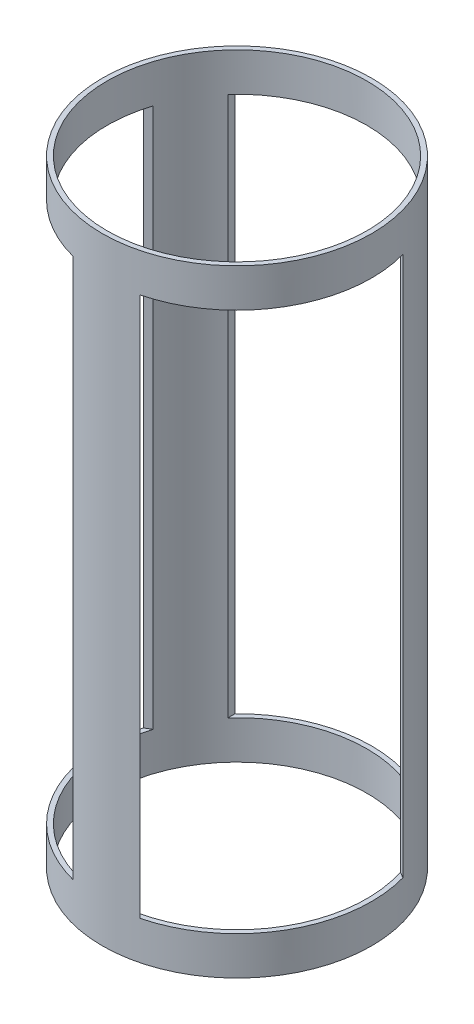
ISO-10303-21;
HEADER;
FILE_DESCRIPTION(('STEP AP214'),'2;1');
FILE_NAME('part.step','',(''),(''),'','','');
FILE_SCHEMA(('AUTOMOTIVE_DESIGN { 1 0 10303 214 1 1 1 1 }'));
ENDSEC;
DATA;
#1=APPLICATION_CONTEXT('core data for automotive mechanical design processes');
#2=APPLICATION_PROTOCOL_DEFINITION('international standard','automotive_design',2000,#1);
#3=PRODUCT_CONTEXT('',#1,'mechanical');
#4=PRODUCT('Part','Part','',(#3));
#5=PRODUCT_RELATED_PRODUCT_CATEGORY('part','',(#4));
#6=PRODUCT_DEFINITION_FORMATION('','',#4);
#7=PRODUCT_DEFINITION_CONTEXT('part definition',#1,'design');
#8=PRODUCT_DEFINITION('design','',#6,#7);
#9=PRODUCT_DEFINITION_SHAPE('','',#8);
#10=(LENGTH_UNIT() NAMED_UNIT(*) SI_UNIT(.MILLI.,.METRE.));
#11=(NAMED_UNIT(*) PLANE_ANGLE_UNIT() SI_UNIT($,.RADIAN.));
#12=(NAMED_UNIT(*) SI_UNIT($,.STERADIAN.) SOLID_ANGLE_UNIT());
#13=UNCERTAINTY_MEASURE_WITH_UNIT(LENGTH_MEASURE(1.E-05),#10,'distance_accuracy_value','');
#14=(GEOMETRIC_REPRESENTATION_CONTEXT(3) GLOBAL_UNCERTAINTY_ASSIGNED_CONTEXT((#13)) GLOBAL_UNIT_ASSIGNED_CONTEXT((#10,
#11,#12)) REPRESENTATION_CONTEXT('',''));
#15=CARTESIAN_POINT('',(0.,0.,0.));
#16=DIRECTION('',(0.,0.,1.));
#17=DIRECTION('',(1.,0.,0.));
#18=AXIS2_PLACEMENT_3D('',#15,#16,#17);
#19=CARTESIAN_POINT('',(0.,203.581,0.));
#20=DIRECTION('',(0.,1.,0.));
#21=DIRECTION('',(0.,0.,1.));
#22=AXIS2_PLACEMENT_3D('',#19,#20,#21);
#23=PLANE('',#22);
#24=CARTESIAN_POINT('',(0.,203.581,0.));
#25=DIRECTION('',(0.,1.,0.));
#26=DIRECTION('',(0.,0.,1.));
#27=AXIS2_PLACEMENT_3D('',#24,#25,#26);
#28=CIRCLE('',#27,88.9);
#29=CARTESIAN_POINT('',(0.,203.581,88.9));
#30=VERTEX_POINT('',#29);
#31=EDGE_CURVE('E230',#30,#30,#28,.T.);
#32=ORIENTED_EDGE('',*,*,#31,.T.);
#33=EDGE_LOOP('',(#32));
#34=FACE_BOUND('',#33,.T.);
#35=CARTESIAN_POINT('',(0.,203.581,0.));
#36=DIRECTION('',(0.,1.,0.));
#37=DIRECTION('',(0.,0.,1.));
#38=AXIS2_PLACEMENT_3D('',#35,#36,#37);
#39=CIRCLE('',#38,85.725);
#40=CARTESIAN_POINT('',(0.,203.581,85.725));
#41=VERTEX_POINT('',#40);
#42=EDGE_CURVE('E224',#41,#41,#39,.T.);
#43=ORIENTED_EDGE('',*,*,#42,.F.);
#44=EDGE_LOOP('',(#43));
#45=FACE_BOUND('',#44,.T.);
#46=ADVANCED_FACE('F45',(#34,#45),#23,.T.);
#47=CARTESIAN_POINT('',(0.,-203.581,0.));
#48=DIRECTION('',(0.,1.,0.));
#49=DIRECTION('',(0.,0.,1.));
#50=AXIS2_PLACEMENT_3D('',#47,#48,#49);
#51=PLANE('',#50);
#52=CARTESIAN_POINT('',(0.,-203.581,0.));
#53=DIRECTION('',(0.,1.,0.));
#54=DIRECTION('',(0.,0.,1.));
#55=AXIS2_PLACEMENT_3D('',#52,#53,#54);
#56=CIRCLE('',#55,88.9);
#57=CARTESIAN_POINT('',(0.,-203.581,88.9));
#58=VERTEX_POINT('',#57);
#59=EDGE_CURVE('E227',#58,#58,#56,.T.);
#60=ORIENTED_EDGE('',*,*,#59,.F.);
#61=EDGE_LOOP('',(#60));
#62=FACE_BOUND('',#61,.T.);
#63=CARTESIAN_POINT('',(0.,-203.581,0.));
#64=DIRECTION('',(0.,1.,0.));
#65=DIRECTION('',(0.,0.,1.));
#66=AXIS2_PLACEMENT_3D('',#63,#64,#65);
#67=CIRCLE('',#66,85.725);
#68=CARTESIAN_POINT('',(0.,-203.581,85.725));
#69=VERTEX_POINT('',#68);
#70=EDGE_CURVE('E204',#69,#69,#67,.T.);
#71=ORIENTED_EDGE('',*,*,#70,.T.);
#72=EDGE_LOOP('',(#71));
#73=FACE_BOUND('',#72,.T.);
#74=ADVANCED_FACE('F260',(#62,#73),#51,.F.);
#75=CARTESIAN_POINT('',(0.,203.581,0.));
#76=DIRECTION('',(0.,-1.,0.));
#77=DIRECTION('',(0.,0.,-1.));
#78=AXIS2_PLACEMENT_3D('',#75,#76,#77);
#79=CYLINDRICAL_SURFACE('',#78,88.9);
#80=CARTESIAN_POINT('',(0.,-178.181,0.));
#81=DIRECTION('',(0.,-1.,0.));
#82=DIRECTION('',(0.866025403784436,0.,0.500000000000004));
#83=AXIS2_PLACEMENT_3D('',#80,#81,#82);
#84=CIRCLE('',#83,88.9);
#85=CARTESIAN_POINT('',(22.1315367264145,-178.181,86.1011328736583));
#86=VERTEX_POINT('',#85);
#87=CARTESIAN_POINT('',(85.631536726415,-178.181,-23.8840934069651));
#88=VERTEX_POINT('',#87);
#89=EDGE_CURVE('E166',#86,#88,#84,.F.);
#90=ORIENTED_EDGE('',*,*,#89,.F.);
#91=DIRECTION('',(0.,-1.,0.));
#92=VECTOR('',#91,1.);
#93=CARTESIAN_POINT('',(22.1315367264145,203.581,86.1011328736583));
#94=LINE('',#93,#92);
#95=CARTESIAN_POINT('',(22.1315367264145,178.181,86.1011328736583));
#96=VERTEX_POINT('',#95);
#97=EDGE_CURVE('E171',#96,#86,#94,.T.);
#98=ORIENTED_EDGE('',*,*,#97,.F.);
#99=CARTESIAN_POINT('',(0.,178.181,0.));
#100=DIRECTION('',(0.,1.,0.));
#101=DIRECTION('',(-0.866025403784436,0.,-0.500000000000004));
#102=AXIS2_PLACEMENT_3D('',#99,#100,#101);
#103=CIRCLE('',#102,88.9);
#104=CARTESIAN_POINT('',(85.631536726415,178.181,-23.8840934069651));
#105=VERTEX_POINT('',#104);
#106=EDGE_CURVE('E145',#105,#96,#103,.F.);
#107=ORIENTED_EDGE('',*,*,#106,.F.);
#108=DIRECTION('',(0.,-1.,0.));
#109=VECTOR('',#108,1.);
#110=CARTESIAN_POINT('',(85.631536726415,203.581,-23.8840934069651));
#111=LINE('',#110,#109);
#112=EDGE_CURVE('E60',#88,#105,#111,.F.);
#113=ORIENTED_EDGE('',*,*,#112,.F.);
#114=EDGE_LOOP('',(#90,#98,#107,#113));
#115=FACE_BOUND('',#114,.T.);
#116=CARTESIAN_POINT('',(0.,-178.181,0.));
#117=DIRECTION('',(0.,-1.,0.));
#118=DIRECTION('',(-0.866025403784443,0.,0.499999999999992));
#119=AXIS2_PLACEMENT_3D('',#116,#117,#118);
#120=CIRCLE('',#119,88.9);
#121=CARTESIAN_POINT('',(-85.6315367264147,-178.181,-23.8840934069663));
#122=VERTEX_POINT('',#121);
#123=CARTESIAN_POINT('',(-22.1315367264157,-178.181,86.101132873658));
#124=VERTEX_POINT('',#123);
#125=EDGE_CURVE('E195',#122,#124,#120,.F.);
#126=ORIENTED_EDGE('',*,*,#125,.F.);
#127=DIRECTION('',(0.,-1.,0.));
#128=VECTOR('',#127,1.);
#129=CARTESIAN_POINT('',(-85.6315367264147,203.581,-23.8840934069663));
#130=LINE('',#129,#128);
#131=CARTESIAN_POINT('',(-85.6315367264147,178.181,-23.8840934069663));
#132=VERTEX_POINT('',#131);
#133=EDGE_CURVE('E146',#132,#122,#130,.T.);
#134=ORIENTED_EDGE('',*,*,#133,.F.);
#135=CARTESIAN_POINT('',(0.,178.181,0.));
#136=DIRECTION('',(0.,1.,0.));
#137=DIRECTION('',(0.866025403784443,0.,-0.499999999999992));
#138=AXIS2_PLACEMENT_3D('',#135,#136,#137);
#139=CIRCLE('',#138,88.9);
#140=CARTESIAN_POINT('',(-22.1315367264157,178.181,86.101132873658));
#141=VERTEX_POINT('',#140);
#142=EDGE_CURVE('E177',#141,#132,#139,.F.);
#143=ORIENTED_EDGE('',*,*,#142,.F.);
#144=DIRECTION('',(0.,-1.,0.));
#145=VECTOR('',#144,1.);
#146=CARTESIAN_POINT('',(-22.1315367264157,203.581,86.101132873658));
#147=LINE('',#146,#145);
#148=EDGE_CURVE('E68',#124,#141,#147,.F.);
#149=ORIENTED_EDGE('',*,*,#148,.F.);
#150=EDGE_LOOP('',(#126,#134,#143,#149));
#151=FACE_BOUND('',#150,.T.);
#152=CARTESIAN_POINT('',(0.,-178.181,0.));
#153=DIRECTION('',(0.,-1.,0.));
#154=DIRECTION('',(0.,0.,-1.));
#155=AXIS2_PLACEMENT_3D('',#152,#153,#154);
#156=CIRCLE('',#155,88.9);
#157=CARTESIAN_POINT('',(63.5,-178.181,-62.2170394666927));
#158=VERTEX_POINT('',#157);
#159=CARTESIAN_POINT('',(-63.5,-178.181,-62.2170394666927));
#160=VERTEX_POINT('',#159);
#161=EDGE_CURVE('E205',#158,#160,#156,.F.);
#162=ORIENTED_EDGE('',*,*,#161,.F.);
#163=DIRECTION('',(0.,-1.,0.));
#164=VECTOR('',#163,1.);
#165=CARTESIAN_POINT('',(63.5,203.581,-62.2170394666927));
#166=LINE('',#165,#164);
#167=CARTESIAN_POINT('',(63.5,178.181,-62.2170394666927));
#168=VERTEX_POINT('',#167);
#169=EDGE_CURVE('E208',#168,#158,#166,.T.);
#170=ORIENTED_EDGE('',*,*,#169,.F.);
#171=CARTESIAN_POINT('',(0.,178.181,0.));
#172=DIRECTION('',(0.,1.,0.));
#173=DIRECTION('',(0.,0.,1.));
#174=AXIS2_PLACEMENT_3D('',#171,#172,#173);
#175=CIRCLE('',#174,88.9);
#176=CARTESIAN_POINT('',(-63.5,178.181,-62.2170394666927));
#177=VERTEX_POINT('',#176);
#178=EDGE_CURVE('E211',#177,#168,#175,.F.);
#179=ORIENTED_EDGE('',*,*,#178,.F.);
#180=DIRECTION('',(0.,-1.,0.));
#181=VECTOR('',#180,1.);
#182=CARTESIAN_POINT('',(-63.5,203.581,-62.2170394666927));
#183=LINE('',#182,#181);
#184=EDGE_CURVE('E202',#160,#177,#183,.F.);
#185=ORIENTED_EDGE('',*,*,#184,.F.);
#186=EDGE_LOOP('',(#162,#170,#179,#185));
#187=FACE_BOUND('',#186,.T.);
#188=ORIENTED_EDGE('',*,*,#31,.F.);
#189=EDGE_LOOP('',(#188));
#190=FACE_BOUND('',#189,.T.);
#191=ORIENTED_EDGE('',*,*,#59,.T.);
#192=EDGE_LOOP('',(#191));
#193=FACE_BOUND('',#192,.T.);
#194=ADVANCED_FACE('F47',(#115,#151,#187,#190,#193),#79,.T.);
#195=CARTESIAN_POINT('',(0.,203.581,0.));
#196=DIRECTION('',(0.,-1.,0.));
#197=DIRECTION('',(0.,0.,-1.));
#198=AXIS2_PLACEMENT_3D('',#195,#196,#197);
#199=CYLINDRICAL_SURFACE('',#198,85.725);
#200=DIRECTION('',(0.,-1.,0.));
#201=VECTOR('',#200,1.);
#202=CARTESIAN_POINT('',(18.1237828798855,203.581,83.787255111519));
#203=LINE('',#202,#201);
#204=CARTESIAN_POINT('',(18.1237828798855,-178.181,83.787255111519));
#205=VERTEX_POINT('',#204);
#206=CARTESIAN_POINT('',(18.1237828798855,178.181,83.787255111519));
#207=VERTEX_POINT('',#206);
#208=EDGE_CURVE('E169',#205,#207,#203,.F.);
#209=ORIENTED_EDGE('',*,*,#208,.F.);
#210=CARTESIAN_POINT('',(0.,-178.181,0.));
#211=DIRECTION('',(0.,-1.,0.));
#212=DIRECTION('',(0.866025403784436,0.,0.500000000000004));
#213=AXIS2_PLACEMENT_3D('',#210,#211,#212);
#214=CIRCLE('',#213,85.725);
#215=CARTESIAN_POINT('',(81.623782879886,-178.181,-26.1979711691044));
#216=VERTEX_POINT('',#215);
#217=EDGE_CURVE('E155',#216,#205,#214,.T.);
#218=ORIENTED_EDGE('',*,*,#217,.F.);
#219=DIRECTION('',(0.,-1.,0.));
#220=VECTOR('',#219,1.);
#221=CARTESIAN_POINT('',(81.623782879886,203.581,-26.1979711691044));
#222=LINE('',#221,#220);
#223=CARTESIAN_POINT('',(81.623782879886,178.181,-26.1979711691044));
#224=VERTEX_POINT('',#223);
#225=EDGE_CURVE('E149',#224,#216,#222,.T.);
#226=ORIENTED_EDGE('',*,*,#225,.F.);
#227=CARTESIAN_POINT('',(0.,178.181,0.));
#228=DIRECTION('',(0.,1.,0.));
#229=DIRECTION('',(-0.866025403784436,0.,-0.500000000000004));
#230=AXIS2_PLACEMENT_3D('',#227,#228,#229);
#231=CIRCLE('',#230,85.725);
#232=EDGE_CURVE('E136',#207,#224,#231,.T.);
#233=ORIENTED_EDGE('',*,*,#232,.F.);
#234=EDGE_LOOP('',(#209,#218,#226,#233));
#235=FACE_BOUND('',#234,.T.);
#236=DIRECTION('',(0.,-1.,0.));
#237=VECTOR('',#236,1.);
#238=CARTESIAN_POINT('',(-81.6237828798856,203.581,-26.1979711691055));
#239=LINE('',#238,#237);
#240=CARTESIAN_POINT('',(-81.6237828798856,-178.181,-26.1979711691055));
#241=VERTEX_POINT('',#240);
#242=CARTESIAN_POINT('',(-81.6237828798857,178.181,-26.1979711691055));
#243=VERTEX_POINT('',#242);
#244=EDGE_CURVE('E198',#241,#243,#239,.F.);
#245=ORIENTED_EDGE('',*,*,#244,.F.);
#246=CARTESIAN_POINT('',(0.,-178.181,0.));
#247=DIRECTION('',(0.,-1.,0.));
#248=DIRECTION('',(-0.866025403784443,0.,0.499999999999992));
#249=AXIS2_PLACEMENT_3D('',#246,#247,#248);
#250=CIRCLE('',#249,85.725);
#251=CARTESIAN_POINT('',(-18.1237828798867,-178.181,83.7872551115187));
#252=VERTEX_POINT('',#251);
#253=EDGE_CURVE('E190',#252,#241,#250,.T.);
#254=ORIENTED_EDGE('',*,*,#253,.F.);
#255=DIRECTION('',(0.,-1.,0.));
#256=VECTOR('',#255,1.);
#257=CARTESIAN_POINT('',(-18.1237828798867,203.581,83.7872551115187));
#258=LINE('',#257,#256);
#259=CARTESIAN_POINT('',(-18.1237828798867,178.181,83.7872551115187));
#260=VERTEX_POINT('',#259);
#261=EDGE_CURVE('E184',#260,#252,#258,.T.);
#262=ORIENTED_EDGE('',*,*,#261,.F.);
#263=CARTESIAN_POINT('',(0.,178.181,0.));
#264=DIRECTION('',(0.,1.,0.));
#265=DIRECTION('',(0.866025403784443,0.,-0.499999999999992));
#266=AXIS2_PLACEMENT_3D('',#263,#264,#265);
#267=CIRCLE('',#266,85.725);
#268=EDGE_CURVE('E175',#243,#260,#267,.T.);
#269=ORIENTED_EDGE('',*,*,#268,.F.);
#270=EDGE_LOOP('',(#245,#254,#262,#269));
#271=FACE_BOUND('',#270,.T.);
#272=DIRECTION('',(0.,-1.,0.));
#273=VECTOR('',#272,1.);
#274=CARTESIAN_POINT('',(63.5,203.581,-57.5892839424141));
#275=LINE('',#274,#273);
#276=CARTESIAN_POINT('',(63.5,-178.181,-57.5892839424141));
#277=VERTEX_POINT('',#276);
#278=CARTESIAN_POINT('',(63.5,178.181,-57.5892839424141));
#279=VERTEX_POINT('',#278);
#280=EDGE_CURVE('E11',#277,#279,#275,.F.);
#281=ORIENTED_EDGE('',*,*,#280,.F.);
#282=CARTESIAN_POINT('',(0.,-178.181,0.));
#283=DIRECTION('',(0.,-1.,0.));
#284=DIRECTION('',(0.,0.,-1.));
#285=AXIS2_PLACEMENT_3D('',#282,#283,#284);
#286=CIRCLE('',#285,85.725);
#287=CARTESIAN_POINT('',(-63.5,-178.181,-57.5892839424141));
#288=VERTEX_POINT('',#287);
#289=EDGE_CURVE('E53',#288,#277,#286,.T.);
#290=ORIENTED_EDGE('',*,*,#289,.F.);
#291=DIRECTION('',(0.,-1.,0.));
#292=VECTOR('',#291,1.);
#293=CARTESIAN_POINT('',(-63.5,203.581,-57.5892839424141));
#294=LINE('',#293,#292);
#295=CARTESIAN_POINT('',(-63.5,178.181,-57.5892839424141));
#296=VERTEX_POINT('',#295);
#297=EDGE_CURVE('E237',#296,#288,#294,.T.);
#298=ORIENTED_EDGE('',*,*,#297,.F.);
#299=CARTESIAN_POINT('',(0.,178.181,0.));
#300=DIRECTION('',(0.,1.,0.));
#301=DIRECTION('',(0.,0.,1.));
#302=AXIS2_PLACEMENT_3D('',#299,#300,#301);
#303=CIRCLE('',#302,85.725);
#304=EDGE_CURVE('E233',#279,#296,#303,.T.);
#305=ORIENTED_EDGE('',*,*,#304,.F.);
#306=EDGE_LOOP('',(#281,#290,#298,#305));
#307=FACE_BOUND('',#306,.T.);
#308=ORIENTED_EDGE('',*,*,#42,.T.);
#309=EDGE_LOOP('',(#308));
#310=FACE_BOUND('',#309,.T.);
#311=ORIENTED_EDGE('',*,*,#70,.F.);
#312=EDGE_LOOP('',(#311));
#313=FACE_BOUND('',#312,.T.);
#314=ADVANCED_FACE('F153',(#235,#271,#307,#310,#313),#199,.F.);
#315=CARTESIAN_POINT('',(63.5,-178.181,-88.901));
#316=DIRECTION('',(1.,0.,0.));
#317=DIRECTION('',(0.,0.,-1.));
#318=AXIS2_PLACEMENT_3D('',#315,#316,#317);
#319=PLANE('',#318);
#320=ORIENTED_EDGE('',*,*,#280,.T.);
#321=DIRECTION('',(0.,0.,1.));
#322=VECTOR('',#321,1.);
#323=CARTESIAN_POINT('',(63.5,178.181,-88.901));
#324=LINE('',#323,#322);
#325=EDGE_CURVE('E174',#168,#279,#324,.T.);
#326=ORIENTED_EDGE('',*,*,#325,.F.);
#327=ORIENTED_EDGE('',*,*,#169,.T.);
#328=DIRECTION('',(0.,0.,1.));
#329=VECTOR('',#328,1.);
#330=CARTESIAN_POINT('',(63.5,-178.181,-88.901));
#331=LINE('',#330,#329);
#332=EDGE_CURVE('E215',#158,#277,#331,.T.);
#333=ORIENTED_EDGE('',*,*,#332,.T.);
#334=EDGE_LOOP('',(#320,#326,#327,#333));
#335=FACE_BOUND('',#334,.T.);
#336=ADVANCED_FACE('F245',(#335),#319,.F.);
#337=CARTESIAN_POINT('',(-63.5,-178.181,-88.901));
#338=DIRECTION('',(0.,-1.,0.));
#339=DIRECTION('',(0.,0.,-1.));
#340=AXIS2_PLACEMENT_3D('',#337,#338,#339);
#341=PLANE('',#340);
#342=ORIENTED_EDGE('',*,*,#289,.T.);
#343=ORIENTED_EDGE('',*,*,#332,.F.);
#344=ORIENTED_EDGE('',*,*,#161,.T.);
#345=DIRECTION('',(0.,0.,1.));
#346=VECTOR('',#345,1.);
#347=CARTESIAN_POINT('',(-63.5,-178.181,-88.901));
#348=LINE('',#347,#346);
#349=EDGE_CURVE('E218',#160,#288,#348,.T.);
#350=ORIENTED_EDGE('',*,*,#349,.T.);
#351=EDGE_LOOP('',(#342,#343,#344,#350));
#352=FACE_BOUND('',#351,.T.);
#353=ADVANCED_FACE('F240',(#352),#341,.F.);
#354=CARTESIAN_POINT('',(-63.5,-178.181,-88.901));
#355=DIRECTION('',(-1.,0.,0.));
#356=DIRECTION('',(0.,0.,1.));
#357=AXIS2_PLACEMENT_3D('',#354,#355,#356);
#358=PLANE('',#357);
#359=ORIENTED_EDGE('',*,*,#297,.T.);
#360=ORIENTED_EDGE('',*,*,#349,.F.);
#361=ORIENTED_EDGE('',*,*,#184,.T.);
#362=DIRECTION('',(0.,0.,1.));
#363=VECTOR('',#362,1.);
#364=CARTESIAN_POINT('',(-63.5,178.181,-88.901));
#365=LINE('',#364,#363);
#366=EDGE_CURVE('E214',#177,#296,#365,.T.);
#367=ORIENTED_EDGE('',*,*,#366,.T.);
#368=EDGE_LOOP('',(#359,#360,#361,#367));
#369=FACE_BOUND('',#368,.T.);
#370=ADVANCED_FACE('F255',(#369),#358,.F.);
#371=CARTESIAN_POINT('',(-63.5,178.181,-88.901));
#372=DIRECTION('',(0.,1.,0.));
#373=DIRECTION('',(0.,0.,1.));
#374=AXIS2_PLACEMENT_3D('',#371,#372,#373);
#375=PLANE('',#374);
#376=ORIENTED_EDGE('',*,*,#304,.T.);
#377=ORIENTED_EDGE('',*,*,#366,.F.);
#378=ORIENTED_EDGE('',*,*,#178,.T.);
#379=ORIENTED_EDGE('',*,*,#325,.T.);
#380=EDGE_LOOP('',(#376,#377,#378,#379));
#381=FACE_BOUND('',#380,.T.);
#382=ADVANCED_FACE('F252',(#381),#375,.F.);
#383=CARTESIAN_POINT('',(-108.74052442184,-178.181,-10.5421131403129));
#384=DIRECTION('',(-0.499999999999992,0.,-0.866025403784443));
#385=DIRECTION('',(-0.866025403784443,0.,0.499999999999992));
#386=AXIS2_PLACEMENT_3D('',#383,#384,#385);
#387=PLANE('',#386);
#388=ORIENTED_EDGE('',*,*,#244,.T.);
#389=DIRECTION('',(0.866025403784443,0.,-0.499999999999992));
#390=VECTOR('',#389,1.);
#391=CARTESIAN_POINT('',(-108.74052442184,178.181,-10.5421131403129));
#392=LINE('',#391,#390);
#393=EDGE_CURVE('E181',#132,#243,#392,.T.);
#394=ORIENTED_EDGE('',*,*,#393,.F.);
#395=ORIENTED_EDGE('',*,*,#133,.T.);
#396=DIRECTION('',(0.866025403784443,0.,-0.499999999999992));
#397=VECTOR('',#396,1.);
#398=CARTESIAN_POINT('',(-108.74052442184,-178.181,-10.5421131403129));
#399=LINE('',#398,#397);
#400=EDGE_CURVE('E192',#122,#241,#399,.T.);
#401=ORIENTED_EDGE('',*,*,#400,.T.);
#402=EDGE_LOOP('',(#388,#394,#395,#401));
#403=FACE_BOUND('',#402,.T.);
#404=ADVANCED_FACE('F302',(#403),#387,.F.);
#405=CARTESIAN_POINT('',(-45.2405244218413,-178.181,99.4431131403114));
#406=DIRECTION('',(0.,-1.,0.));
#407=DIRECTION('',(-0.866025403784443,0.,0.499999999999992));
#408=AXIS2_PLACEMENT_3D('',#405,#406,#407);
#409=PLANE('',#408);
#410=ORIENTED_EDGE('',*,*,#253,.T.);
#411=ORIENTED_EDGE('',*,*,#400,.F.);
#412=ORIENTED_EDGE('',*,*,#125,.T.);
#413=DIRECTION('',(0.866025403784443,0.,-0.499999999999992));
#414=VECTOR('',#413,1.);
#415=CARTESIAN_POINT('',(-45.2405244218413,-178.181,99.4431131403114));
#416=LINE('',#415,#414);
#417=EDGE_CURVE('E186',#124,#252,#416,.T.);
#418=ORIENTED_EDGE('',*,*,#417,.T.);
#419=EDGE_LOOP('',(#410,#411,#412,#418));
#420=FACE_BOUND('',#419,.T.);
#421=ADVANCED_FACE('F308',(#420),#409,.F.);
#422=CARTESIAN_POINT('',(-45.2405244218413,-178.181,99.4431131403114));
#423=DIRECTION('',(0.499999999999992,0.,0.866025403784443));
#424=DIRECTION('',(0.866025403784443,0.,-0.499999999999992));
#425=AXIS2_PLACEMENT_3D('',#422,#423,#424);
#426=PLANE('',#425);
#427=ORIENTED_EDGE('',*,*,#261,.T.);
#428=ORIENTED_EDGE('',*,*,#417,.F.);
#429=ORIENTED_EDGE('',*,*,#148,.T.);
#430=DIRECTION('',(0.866025403784443,0.,-0.499999999999992));
#431=VECTOR('',#430,1.);
#432=CARTESIAN_POINT('',(-45.2405244218413,178.181,99.4431131403114));
#433=LINE('',#432,#431);
#434=EDGE_CURVE('E179',#141,#260,#433,.T.);
#435=ORIENTED_EDGE('',*,*,#434,.T.);
#436=EDGE_LOOP('',(#427,#428,#429,#435));
#437=FACE_BOUND('',#436,.T.);
#438=ADVANCED_FACE('F322',(#437),#426,.F.);
#439=CARTESIAN_POINT('',(-45.2405244218413,178.181,99.4431131403114));
#440=DIRECTION('',(0.,1.,0.));
#441=DIRECTION('',(0.866025403784443,0.,-0.499999999999992));
#442=AXIS2_PLACEMENT_3D('',#439,#440,#441);
#443=PLANE('',#442);
#444=ORIENTED_EDGE('',*,*,#268,.T.);
#445=ORIENTED_EDGE('',*,*,#434,.F.);
#446=ORIENTED_EDGE('',*,*,#142,.T.);
#447=ORIENTED_EDGE('',*,*,#393,.T.);
#448=EDGE_LOOP('',(#444,#445,#446,#447));
#449=FACE_BOUND('',#448,.T.);
#450=ADVANCED_FACE('F334',(#449),#443,.F.);
#451=CARTESIAN_POINT('',(45.2405244218399,-178.181,99.4431131403121));
#452=DIRECTION('',(-0.500000000000004,0.,0.866025403784436));
#453=DIRECTION('',(0.866025403784436,0.,0.500000000000004));
#454=AXIS2_PLACEMENT_3D('',#451,#452,#453);
#455=PLANE('',#454);
#456=ORIENTED_EDGE('',*,*,#208,.T.);
#457=DIRECTION('',(-0.866025403784436,0.,-0.500000000000004));
#458=VECTOR('',#457,1.);
#459=CARTESIAN_POINT('',(45.2405244218399,178.181,99.4431131403121));
#460=LINE('',#459,#458);
#461=EDGE_CURVE('E141',#96,#207,#460,.T.);
#462=ORIENTED_EDGE('',*,*,#461,.F.);
#463=ORIENTED_EDGE('',*,*,#97,.T.);
#464=DIRECTION('',(-0.866025403784436,0.,-0.500000000000004));
#465=VECTOR('',#464,1.);
#466=CARTESIAN_POINT('',(45.2405244218399,-178.181,99.4431131403121));
#467=LINE('',#466,#465);
#468=EDGE_CURVE('E163',#86,#205,#467,.T.);
#469=ORIENTED_EDGE('',*,*,#468,.T.);
#470=EDGE_LOOP('',(#456,#462,#463,#469));
#471=FACE_BOUND('',#470,.T.);
#472=ADVANCED_FACE('F345',(#471),#455,.F.);
#473=CARTESIAN_POINT('',(108.74052442184,-178.181,-10.5421131403113));
#474=DIRECTION('',(0.,-1.,0.));
#475=DIRECTION('',(0.866025403784436,0.,0.500000000000004));
#476=AXIS2_PLACEMENT_3D('',#473,#474,#475);
#477=PLANE('',#476);
#478=ORIENTED_EDGE('',*,*,#217,.T.);
#479=ORIENTED_EDGE('',*,*,#468,.F.);
#480=ORIENTED_EDGE('',*,*,#89,.T.);
#481=DIRECTION('',(-0.866025403784436,0.,-0.500000000000004));
#482=VECTOR('',#481,1.);
#483=CARTESIAN_POINT('',(108.74052442184,-178.181,-10.5421131403113));
#484=LINE('',#483,#482);
#485=EDGE_CURVE('E156',#88,#216,#484,.T.);
#486=ORIENTED_EDGE('',*,*,#485,.T.);
#487=EDGE_LOOP('',(#478,#479,#480,#486));
#488=FACE_BOUND('',#487,.T.);
#489=ADVANCED_FACE('F356',(#488),#477,.F.);
#490=CARTESIAN_POINT('',(108.74052442184,-178.181,-10.5421131403113));
#491=DIRECTION('',(0.500000000000004,0.,-0.866025403784436));
#492=DIRECTION('',(-0.866025403784436,0.,-0.500000000000004));
#493=AXIS2_PLACEMENT_3D('',#490,#491,#492);
#494=PLANE('',#493);
#495=ORIENTED_EDGE('',*,*,#225,.T.);
#496=ORIENTED_EDGE('',*,*,#485,.F.);
#497=ORIENTED_EDGE('',*,*,#112,.T.);
#498=DIRECTION('',(-0.866025403784436,0.,-0.500000000000004));
#499=VECTOR('',#498,1.);
#500=CARTESIAN_POINT('',(108.74052442184,178.181,-10.5421131403113));
#501=LINE('',#500,#499);
#502=EDGE_CURVE('E138',#105,#224,#501,.T.);
#503=ORIENTED_EDGE('',*,*,#502,.T.);
#504=EDGE_LOOP('',(#495,#496,#497,#503));
#505=FACE_BOUND('',#504,.T.);
#506=ADVANCED_FACE('F148',(#505),#494,.F.);
#507=CARTESIAN_POINT('',(108.74052442184,178.181,-10.5421131403113));
#508=DIRECTION('',(0.,1.,0.));
#509=DIRECTION('',(-0.866025403784436,0.,-0.500000000000004));
#510=AXIS2_PLACEMENT_3D('',#507,#508,#509);
#511=PLANE('',#510);
#512=ORIENTED_EDGE('',*,*,#232,.T.);
#513=ORIENTED_EDGE('',*,*,#502,.F.);
#514=ORIENTED_EDGE('',*,*,#106,.T.);
#515=ORIENTED_EDGE('',*,*,#461,.T.);
#516=EDGE_LOOP('',(#512,#513,#514,#515));
#517=FACE_BOUND('',#516,.T.);
#518=ADVANCED_FACE('F137',(#517),#511,.F.);
#519=CLOSED_SHELL('',(#46,#74,#194,#314,#336,#353,#370,#382,#404,#421,#438,#450,#472,#489,#506,#518));
#520=MANIFOLD_SOLID_BREP('B2',#519);
#521=ADVANCED_BREP_SHAPE_REPRESENTATION('',(#18,#520),#14);
#522=SHAPE_DEFINITION_REPRESENTATION(#9,#521);
ENDSEC;
END-ISO-10303-21;
